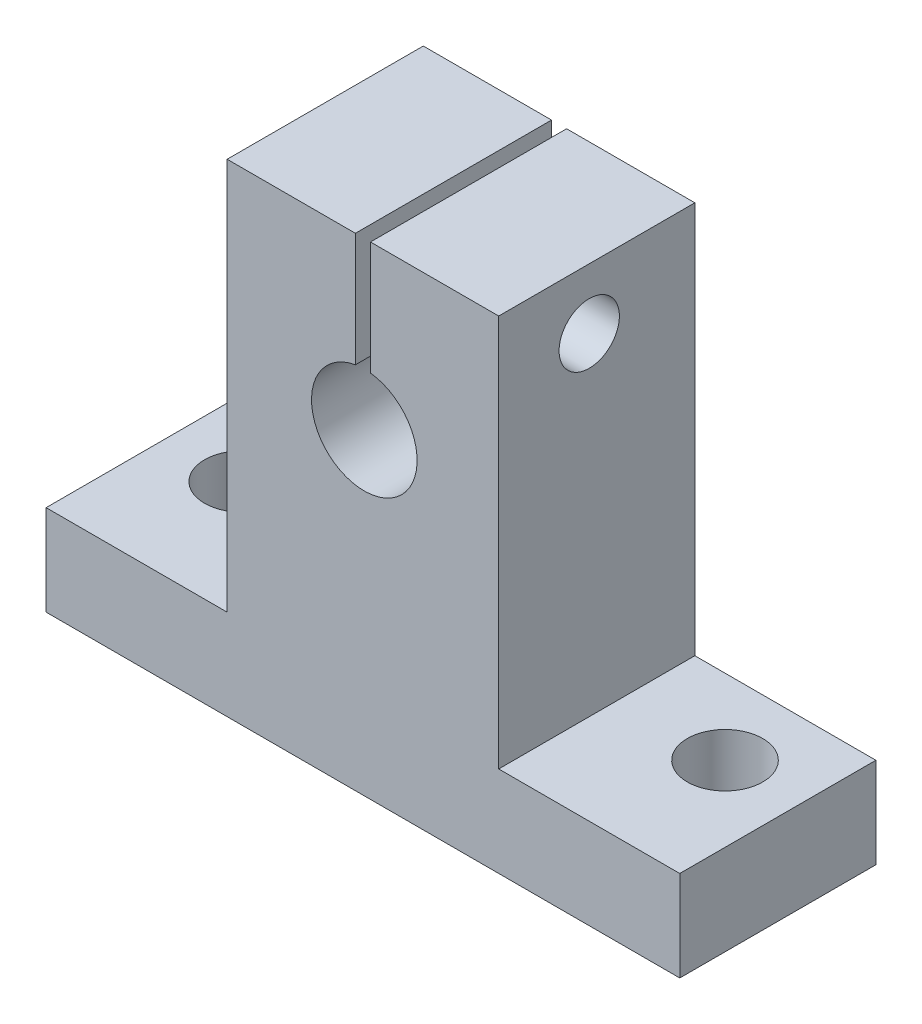
ISO-10303-21;
HEADER;
FILE_DESCRIPTION(('STEP AP214'),'2;1');
FILE_NAME('part.step','',(''),(''),'','','');
FILE_SCHEMA(('AUTOMOTIVE_DESIGN { 1 0 10303 214 1 1 1 1 }'));
ENDSEC;
DATA;
#1=APPLICATION_CONTEXT('core data for automotive mechanical design processes');
#2=APPLICATION_PROTOCOL_DEFINITION('international standard','automotive_design',2000,#1);
#3=PRODUCT_CONTEXT('',#1,'mechanical');
#4=PRODUCT('Part','Part','',(#3));
#5=PRODUCT_RELATED_PRODUCT_CATEGORY('part','',(#4));
#6=PRODUCT_DEFINITION_FORMATION('','',#4);
#7=PRODUCT_DEFINITION_CONTEXT('part definition',#1,'design');
#8=PRODUCT_DEFINITION('design','',#6,#7);
#9=PRODUCT_DEFINITION_SHAPE('','',#8);
#10=(LENGTH_UNIT() NAMED_UNIT(*) SI_UNIT(.MILLI.,.METRE.));
#11=(NAMED_UNIT(*) PLANE_ANGLE_UNIT() SI_UNIT($,.RADIAN.));
#12=(NAMED_UNIT(*) SI_UNIT($,.STERADIAN.) SOLID_ANGLE_UNIT());
#13=UNCERTAINTY_MEASURE_WITH_UNIT(LENGTH_MEASURE(1.E-05),#10,'distance_accuracy_value','');
#14=(GEOMETRIC_REPRESENTATION_CONTEXT(3) GLOBAL_UNCERTAINTY_ASSIGNED_CONTEXT((#13)) GLOBAL_UNIT_ASSIGNED_CONTEXT((#10,
#11,#12)) REPRESENTATION_CONTEXT('',''));
#15=CARTESIAN_POINT('',(0.,0.,0.));
#16=DIRECTION('',(0.,0.,1.));
#17=DIRECTION('',(1.,0.,0.));
#18=AXIS2_PLACEMENT_3D('',#15,#16,#17);
#19=CARTESIAN_POINT('',(0.,32.,0.));
#20=DIRECTION('',(0.,1.,0.));
#21=DIRECTION('',(0.,0.,1.));
#22=AXIS2_PLACEMENT_3D('',#19,#20,#21);
#23=PLANE('',#22);
#24=DIRECTION('',(-1.,0.,0.));
#25=VECTOR('',#24,1.);
#26=CARTESIAN_POINT('',(-9.,32.,-6.5));
#27=LINE('',#26,#25);
#28=CARTESIAN_POINT('',(9.,32.,-6.5));
#29=VERTEX_POINT('',#28);
#30=CARTESIAN_POINT('',(0.500000000000001,32.,-6.50000000000001));
#31=VERTEX_POINT('',#30);
#32=EDGE_CURVE('E172',#29,#31,#27,.T.);
#33=ORIENTED_EDGE('',*,*,#32,.T.);
#34=DIRECTION('',(0.,0.,1.));
#35=VECTOR('',#34,1.);
#36=CARTESIAN_POINT('',(0.500000000000001,32.,0.));
#37=LINE('',#36,#35);
#38=CARTESIAN_POINT('',(0.500000000000002,32.,6.5));
#39=VERTEX_POINT('',#38);
#40=EDGE_CURVE('E264',#31,#39,#37,.T.);
#41=ORIENTED_EDGE('',*,*,#40,.T.);
#42=DIRECTION('',(1.,0.,0.));
#43=VECTOR('',#42,1.);
#44=CARTESIAN_POINT('',(-9.,32.,6.5));
#45=LINE('',#44,#43);
#46=CARTESIAN_POINT('',(9.,32.,6.5));
#47=VERTEX_POINT('',#46);
#48=EDGE_CURVE('E151',#39,#47,#45,.T.);
#49=ORIENTED_EDGE('',*,*,#48,.T.);
#50=DIRECTION('',(0.,0.,-1.));
#51=VECTOR('',#50,1.);
#52=CARTESIAN_POINT('',(9.,32.,-6.5));
#53=LINE('',#52,#51);
#54=EDGE_CURVE('E167',#47,#29,#53,.T.);
#55=ORIENTED_EDGE('',*,*,#54,.T.);
#56=EDGE_LOOP('',(#33,#41,#49,#55));
#57=FACE_BOUND('',#56,.T.);
#58=ADVANCED_FACE('F39',(#57),#23,.T.);
#59=CARTESIAN_POINT('',(0.,6.,0.));
#60=DIRECTION('',(0.,-1.,0.));
#61=DIRECTION('',(0.,0.,-1.));
#62=AXIS2_PLACEMENT_3D('',#59,#60,#61);
#63=PLANE('',#62);
#64=CARTESIAN_POINT('',(16.,6.,-1.5));
#65=DIRECTION('',(0.,1.,0.));
#66=DIRECTION('',(0.,0.,1.));
#67=AXIS2_PLACEMENT_3D('',#64,#65,#66);
#68=CIRCLE('',#67,2.5);
#69=CARTESIAN_POINT('',(16.,6.,0.999999999999998));
#70=VERTEX_POINT('',#69);
#71=EDGE_CURVE('E205',#70,#70,#68,.T.);
#72=ORIENTED_EDGE('',*,*,#71,.F.);
#73=EDGE_LOOP('',(#72));
#74=FACE_BOUND('',#73,.T.);
#75=DIRECTION('',(0.,0.,-1.));
#76=VECTOR('',#75,1.);
#77=CARTESIAN_POINT('',(9.,6.,-6.5));
#78=LINE('',#77,#76);
#79=CARTESIAN_POINT('',(9.,6.,6.5));
#80=VERTEX_POINT('',#79);
#81=CARTESIAN_POINT('',(9.,6.,-6.5));
#82=VERTEX_POINT('',#81);
#83=EDGE_CURVE('E166',#80,#82,#78,.T.);
#84=ORIENTED_EDGE('',*,*,#83,.F.);
#85=DIRECTION('',(1.,0.,0.));
#86=VECTOR('',#85,1.);
#87=CARTESIAN_POINT('',(21.,6.,6.5));
#88=LINE('',#87,#86);
#89=CARTESIAN_POINT('',(21.,6.,6.5));
#90=VERTEX_POINT('',#89);
#91=EDGE_CURVE('E225',#80,#90,#88,.T.);
#92=ORIENTED_EDGE('',*,*,#91,.T.);
#93=DIRECTION('',(0.,0.,-1.));
#94=VECTOR('',#93,1.);
#95=CARTESIAN_POINT('',(21.,6.,-6.5));
#96=LINE('',#95,#94);
#97=CARTESIAN_POINT('',(21.,6.,-6.5));
#98=VERTEX_POINT('',#97);
#99=EDGE_CURVE('E230',#90,#98,#96,.T.);
#100=ORIENTED_EDGE('',*,*,#99,.T.);
#101=DIRECTION('',(-1.,0.,0.));
#102=VECTOR('',#101,1.);
#103=CARTESIAN_POINT('',(21.,6.,-6.5));
#104=LINE('',#103,#102);
#105=EDGE_CURVE('E234',#98,#82,#104,.T.);
#106=ORIENTED_EDGE('',*,*,#105,.T.);
#107=EDGE_LOOP('',(#84,#92,#100,#106));
#108=FACE_BOUND('',#107,.T.);
#109=ADVANCED_FACE('F299',(#74,#108),#63,.F.);
#110=CARTESIAN_POINT('',(-16.,6.,-1.5));
#111=DIRECTION('',(0.,1.,0.));
#112=DIRECTION('',(0.,0.,1.));
#113=AXIS2_PLACEMENT_3D('',#110,#111,#112);
#114=CIRCLE('',#113,2.5);
#115=CARTESIAN_POINT('',(-16.,6.,1.));
#116=VERTEX_POINT('',#115);
#117=EDGE_CURVE('E213',#116,#116,#114,.T.);
#118=ORIENTED_EDGE('',*,*,#117,.F.);
#119=EDGE_LOOP('',(#118));
#120=FACE_BOUND('',#119,.T.);
#121=DIRECTION('',(0.,0.,1.));
#122=VECTOR('',#121,1.);
#123=CARTESIAN_POINT('',(-9.,6.,-6.5));
#124=LINE('',#123,#122);
#125=CARTESIAN_POINT('',(-8.99999999999999,6.,-6.5));
#126=VERTEX_POINT('',#125);
#127=CARTESIAN_POINT('',(-9.,6.,6.5));
#128=VERTEX_POINT('',#127);
#129=EDGE_CURVE('E64',#126,#128,#124,.T.);
#130=ORIENTED_EDGE('',*,*,#129,.F.);
#131=CARTESIAN_POINT('',(-21.,6.,-6.5));
#132=VERTEX_POINT('',#131);
#133=EDGE_CURVE('E233',#126,#132,#104,.T.);
#134=ORIENTED_EDGE('',*,*,#133,.T.);
#135=DIRECTION('',(0.,0.,1.));
#136=VECTOR('',#135,1.);
#137=CARTESIAN_POINT('',(-21.,6.,-6.5));
#138=LINE('',#137,#136);
#139=CARTESIAN_POINT('',(-21.,6.,6.5));
#140=VERTEX_POINT('',#139);
#141=EDGE_CURVE('E221',#132,#140,#138,.T.);
#142=ORIENTED_EDGE('',*,*,#141,.T.);
#143=EDGE_CURVE('E227',#140,#128,#88,.T.);
#144=ORIENTED_EDGE('',*,*,#143,.T.);
#145=EDGE_LOOP('',(#130,#134,#142,#144));
#146=FACE_BOUND('',#145,.T.);
#147=ADVANCED_FACE('F282',(#120,#146),#63,.F.);
#148=CARTESIAN_POINT('',(0.,0.,0.));
#149=DIRECTION('',(0.,-1.,0.));
#150=DIRECTION('',(0.,0.,-1.));
#151=AXIS2_PLACEMENT_3D('',#148,#149,#150);
#152=PLANE('',#151);
#153=CARTESIAN_POINT('',(-16.,0.,-1.5));
#154=DIRECTION('',(0.,1.,0.));
#155=DIRECTION('',(0.,0.,1.));
#156=AXIS2_PLACEMENT_3D('',#153,#154,#155);
#157=CIRCLE('',#156,2.5);
#158=CARTESIAN_POINT('',(-16.,0.,1.));
#159=VERTEX_POINT('',#158);
#160=EDGE_CURVE('E209',#159,#159,#157,.T.);
#161=ORIENTED_EDGE('',*,*,#160,.T.);
#162=EDGE_LOOP('',(#161));
#163=FACE_BOUND('',#162,.T.);
#164=DIRECTION('',(0.,0.,1.));
#165=VECTOR('',#164,1.);
#166=CARTESIAN_POINT('',(-21.,0.,-6.5));
#167=LINE('',#166,#165);
#168=CARTESIAN_POINT('',(-21.,0.,-6.5));
#169=VERTEX_POINT('',#168);
#170=CARTESIAN_POINT('',(-21.,0.,6.5));
#171=VERTEX_POINT('',#170);
#172=EDGE_CURVE('E217',#169,#171,#167,.T.);
#173=ORIENTED_EDGE('',*,*,#172,.F.);
#174=DIRECTION('',(-1.,0.,0.));
#175=VECTOR('',#174,1.);
#176=CARTESIAN_POINT('',(21.,0.,-6.5));
#177=LINE('',#176,#175);
#178=CARTESIAN_POINT('',(21.,0.,-6.5));
#179=VERTEX_POINT('',#178);
#180=EDGE_CURVE('E226',#179,#169,#177,.T.);
#181=ORIENTED_EDGE('',*,*,#180,.F.);
#182=DIRECTION('',(0.,0.,-1.));
#183=VECTOR('',#182,1.);
#184=CARTESIAN_POINT('',(21.,0.,-6.5));
#185=LINE('',#184,#183);
#186=CARTESIAN_POINT('',(21.,0.,6.5));
#187=VERTEX_POINT('',#186);
#188=EDGE_CURVE('E244',#187,#179,#185,.T.);
#189=ORIENTED_EDGE('',*,*,#188,.F.);
#190=DIRECTION('',(1.,0.,0.));
#191=VECTOR('',#190,1.);
#192=CARTESIAN_POINT('',(21.,0.,6.5));
#193=LINE('',#192,#191);
#194=EDGE_CURVE('E241',#171,#187,#193,.T.);
#195=ORIENTED_EDGE('',*,*,#194,.F.);
#196=EDGE_LOOP('',(#173,#181,#189,#195));
#197=FACE_BOUND('',#196,.T.);
#198=CARTESIAN_POINT('',(16.,0.,-1.5));
#199=DIRECTION('',(0.,1.,0.));
#200=DIRECTION('',(0.,0.,1.));
#201=AXIS2_PLACEMENT_3D('',#198,#199,#200);
#202=CIRCLE('',#201,2.5);
#203=CARTESIAN_POINT('',(16.,0.,0.999999999999998));
#204=VERTEX_POINT('',#203);
#205=EDGE_CURVE('E204',#204,#204,#202,.T.);
#206=ORIENTED_EDGE('',*,*,#205,.T.);
#207=EDGE_LOOP('',(#206));
#208=FACE_BOUND('',#207,.T.);
#209=ADVANCED_FACE('F288',(#163,#197,#208),#152,.T.);
#210=CARTESIAN_POINT('',(-21.,6.,-6.5));
#211=DIRECTION('',(1.,0.,0.));
#212=DIRECTION('',(0.,0.,-1.));
#213=AXIS2_PLACEMENT_3D('',#210,#211,#212);
#214=PLANE('',#213);
#215=ORIENTED_EDGE('',*,*,#172,.T.);
#216=DIRECTION('',(0.,-1.,0.));
#217=VECTOR('',#216,1.);
#218=CARTESIAN_POINT('',(-21.,6.,6.5));
#219=LINE('',#218,#217);
#220=EDGE_CURVE('E260',#140,#171,#219,.T.);
#221=ORIENTED_EDGE('',*,*,#220,.F.);
#222=ORIENTED_EDGE('',*,*,#141,.F.);
#223=DIRECTION('',(0.,-1.,0.));
#224=VECTOR('',#223,1.);
#225=CARTESIAN_POINT('',(-21.,6.,-6.5));
#226=LINE('',#225,#224);
#227=EDGE_CURVE('E237',#132,#169,#226,.T.);
#228=ORIENTED_EDGE('',*,*,#227,.T.);
#229=EDGE_LOOP('',(#215,#221,#222,#228));
#230=FACE_BOUND('',#229,.T.);
#231=ADVANCED_FACE('F41',(#230),#214,.F.);
#232=CARTESIAN_POINT('',(21.,6.,6.5));
#233=DIRECTION('',(0.,0.,-1.));
#234=DIRECTION('',(-1.,0.,0.));
#235=AXIS2_PLACEMENT_3D('',#232,#233,#234);
#236=PLANE('',#235);
#237=CARTESIAN_POINT('',(0.0919504528195739,21.,6.5));
#238=DIRECTION('',(0.,0.,1.));
#239=DIRECTION('',(1.,0.,0.));
#240=AXIS2_PLACEMENT_3D('',#237,#238,#239);
#241=CIRCLE('',#240,3.5);
#242=CARTESIAN_POINT('',(-0.499999999999998,24.4495789107378,6.5));
#243=VERTEX_POINT('',#242);
#244=CARTESIAN_POINT('',(0.500000000000002,24.4761322712241,6.5));
#245=VERTEX_POINT('',#244);
#246=EDGE_CURVE('E139',#243,#245,#241,.T.);
#247=ORIENTED_EDGE('',*,*,#246,.F.);
#248=DIRECTION('',(0.,-1.,0.));
#249=VECTOR('',#248,1.);
#250=CARTESIAN_POINT('',(-0.499999999999995,0.,6.5));
#251=LINE('',#250,#249);
#252=CARTESIAN_POINT('',(-0.499999999999999,32.,6.5));
#253=VERTEX_POINT('',#252);
#254=EDGE_CURVE('E136',#253,#243,#251,.T.);
#255=ORIENTED_EDGE('',*,*,#254,.F.);
#256=CARTESIAN_POINT('',(-9.,32.,6.5));
#257=VERTEX_POINT('',#256);
#258=EDGE_CURVE('E179',#257,#253,#45,.T.);
#259=ORIENTED_EDGE('',*,*,#258,.F.);
#260=DIRECTION('',(0.,-1.,0.));
#261=VECTOR('',#260,1.);
#262=CARTESIAN_POINT('',(-9.,32.,6.5));
#263=LINE('',#262,#261);
#264=EDGE_CURVE('E192',#257,#128,#263,.T.);
#265=ORIENTED_EDGE('',*,*,#264,.T.);
#266=ORIENTED_EDGE('',*,*,#143,.F.);
#267=ORIENTED_EDGE('',*,*,#220,.T.);
#268=ORIENTED_EDGE('',*,*,#194,.T.);
#269=DIRECTION('',(0.,-1.,0.));
#270=VECTOR('',#269,1.);
#271=CARTESIAN_POINT('',(21.,6.,6.5));
#272=LINE('',#271,#270);
#273=EDGE_CURVE('E256',#90,#187,#272,.T.);
#274=ORIENTED_EDGE('',*,*,#273,.F.);
#275=ORIENTED_EDGE('',*,*,#91,.F.);
#276=DIRECTION('',(0.,-1.,0.));
#277=VECTOR('',#276,1.);
#278=CARTESIAN_POINT('',(9.,32.,6.5));
#279=LINE('',#278,#277);
#280=EDGE_CURVE('E183',#47,#80,#279,.T.);
#281=ORIENTED_EDGE('',*,*,#280,.F.);
#282=ORIENTED_EDGE('',*,*,#48,.F.);
#283=DIRECTION('',(0.,-1.,0.));
#284=VECTOR('',#283,1.);
#285=CARTESIAN_POINT('',(0.500000000000004,0.,6.5));
#286=LINE('',#285,#284);
#287=EDGE_CURVE('E56',#39,#245,#286,.T.);
#288=ORIENTED_EDGE('',*,*,#287,.T.);
#289=EDGE_LOOP('',(#247,#255,#259,#265,#266,#267,#268,#274,#275,#281,#282,#288));
#290=FACE_BOUND('',#289,.T.);
#291=ADVANCED_FACE('F149',(#290),#236,.F.);
#292=CARTESIAN_POINT('',(21.,6.,-6.5));
#293=DIRECTION('',(-1.,0.,0.));
#294=DIRECTION('',(0.,0.,1.));
#295=AXIS2_PLACEMENT_3D('',#292,#293,#294);
#296=PLANE('',#295);
#297=ORIENTED_EDGE('',*,*,#188,.T.);
#298=DIRECTION('',(0.,-1.,0.));
#299=VECTOR('',#298,1.);
#300=CARTESIAN_POINT('',(21.,6.,-6.5));
#301=LINE('',#300,#299);
#302=EDGE_CURVE('E252',#98,#179,#301,.T.);
#303=ORIENTED_EDGE('',*,*,#302,.F.);
#304=ORIENTED_EDGE('',*,*,#99,.F.);
#305=ORIENTED_EDGE('',*,*,#273,.T.);
#306=EDGE_LOOP('',(#297,#303,#304,#305));
#307=FACE_BOUND('',#306,.T.);
#308=ADVANCED_FACE('F295',(#307),#296,.F.);
#309=CARTESIAN_POINT('',(21.,6.,-6.5));
#310=DIRECTION('',(0.,0.,1.));
#311=DIRECTION('',(1.,0.,0.));
#312=AXIS2_PLACEMENT_3D('',#309,#310,#311);
#313=PLANE('',#312);
#314=CARTESIAN_POINT('',(-0.499999999999999,32.,-6.50000000000001));
#315=VERTEX_POINT('',#314);
#316=CARTESIAN_POINT('',(-9.,32.,-6.5));
#317=VERTEX_POINT('',#316);
#318=EDGE_CURVE('E171',#315,#317,#27,.T.);
#319=ORIENTED_EDGE('',*,*,#318,.F.);
#320=DIRECTION('',(0.,-1.,0.));
#321=VECTOR('',#320,1.);
#322=CARTESIAN_POINT('',(-0.499999999999994,6.,-6.5));
#323=LINE('',#322,#321);
#324=CARTESIAN_POINT('',(-0.499999999999998,24.4495789107378,-6.5));
#325=VERTEX_POINT('',#324);
#326=EDGE_CURVE('E162',#315,#325,#323,.T.);
#327=ORIENTED_EDGE('',*,*,#326,.T.);
#328=CARTESIAN_POINT('',(0.0919504528195739,21.,-6.5));
#329=DIRECTION('',(0.,0.,1.));
#330=DIRECTION('',(1.,0.,0.));
#331=AXIS2_PLACEMENT_3D('',#328,#329,#330);
#332=CIRCLE('',#331,3.5);
#333=CARTESIAN_POINT('',(0.500000000000002,24.4761322712241,-6.5));
#334=VERTEX_POINT('',#333);
#335=EDGE_CURVE('E11',#325,#334,#332,.T.);
#336=ORIENTED_EDGE('',*,*,#335,.T.);
#337=DIRECTION('',(0.,-1.,0.));
#338=VECTOR('',#337,1.);
#339=CARTESIAN_POINT('',(0.500000000000004,6.,-6.5));
#340=LINE('',#339,#338);
#341=EDGE_CURVE('E132',#31,#334,#340,.T.);
#342=ORIENTED_EDGE('',*,*,#341,.F.);
#343=ORIENTED_EDGE('',*,*,#32,.F.);
#344=DIRECTION('',(0.,-1.,0.));
#345=VECTOR('',#344,1.);
#346=CARTESIAN_POINT('',(9.,32.,-6.5));
#347=LINE('',#346,#345);
#348=EDGE_CURVE('E200',#29,#82,#347,.T.);
#349=ORIENTED_EDGE('',*,*,#348,.T.);
#350=ORIENTED_EDGE('',*,*,#105,.F.);
#351=ORIENTED_EDGE('',*,*,#302,.T.);
#352=ORIENTED_EDGE('',*,*,#180,.T.);
#353=ORIENTED_EDGE('',*,*,#227,.F.);
#354=ORIENTED_EDGE('',*,*,#133,.F.);
#355=DIRECTION('',(0.,-1.,0.));
#356=VECTOR('',#355,1.);
#357=CARTESIAN_POINT('',(-9.,32.,-6.5));
#358=LINE('',#357,#356);
#359=EDGE_CURVE('E196',#317,#126,#358,.T.);
#360=ORIENTED_EDGE('',*,*,#359,.F.);
#361=EDGE_LOOP('',(#319,#327,#336,#342,#343,#349,#350,#351,#352,#353,#354,#360));
#362=FACE_BOUND('',#361,.T.);
#363=ADVANCED_FACE('F309',(#362),#313,.F.);
#364=CARTESIAN_POINT('',(-16.,6.,-1.5));
#365=DIRECTION('',(0.,-1.,0.));
#366=DIRECTION('',(0.,0.,-1.));
#367=AXIS2_PLACEMENT_3D('',#364,#365,#366);
#368=CYLINDRICAL_SURFACE('',#367,2.5);
#369=ORIENTED_EDGE('',*,*,#117,.T.);
#370=EDGE_LOOP('',(#369));
#371=FACE_BOUND('',#370,.T.);
#372=ORIENTED_EDGE('',*,*,#160,.F.);
#373=EDGE_LOOP('',(#372));
#374=FACE_BOUND('',#373,.T.);
#375=ADVANCED_FACE('F312',(#371,#374),#368,.F.);
#376=CARTESIAN_POINT('',(16.,6.,-1.5));
#377=DIRECTION('',(0.,-1.,0.));
#378=DIRECTION('',(0.,0.,-1.));
#379=AXIS2_PLACEMENT_3D('',#376,#377,#378);
#380=CYLINDRICAL_SURFACE('',#379,2.5);
#381=ORIENTED_EDGE('',*,*,#71,.T.);
#382=EDGE_LOOP('',(#381));
#383=FACE_BOUND('',#382,.T.);
#384=ORIENTED_EDGE('',*,*,#205,.F.);
#385=EDGE_LOOP('',(#384));
#386=FACE_BOUND('',#385,.T.);
#387=ADVANCED_FACE('F318',(#383,#386),#380,.F.);
#388=CARTESIAN_POINT('',(9.,32.,-6.5));
#389=DIRECTION('',(-1.,0.,0.));
#390=DIRECTION('',(0.,0.,1.));
#391=AXIS2_PLACEMENT_3D('',#388,#389,#390);
#392=PLANE('',#391);
#393=CARTESIAN_POINT('',(9.,28.,0.499999999999997));
#394=DIRECTION('',(1.,0.,0.));
#395=DIRECTION('',(0.,0.,-1.));
#396=AXIS2_PLACEMENT_3D('',#393,#394,#395);
#397=CIRCLE('',#396,2.);
#398=CARTESIAN_POINT('',(9.,28.,-1.5));
#399=VERTEX_POINT('',#398);
#400=EDGE_CURVE('E476',#399,#399,#397,.T.);
#401=ORIENTED_EDGE('',*,*,#400,.F.);
#402=EDGE_LOOP('',(#401));
#403=FACE_BOUND('',#402,.T.);
#404=ORIENTED_EDGE('',*,*,#83,.T.);
#405=ORIENTED_EDGE('',*,*,#348,.F.);
#406=ORIENTED_EDGE('',*,*,#54,.F.);
#407=ORIENTED_EDGE('',*,*,#280,.T.);
#408=EDGE_LOOP('',(#404,#405,#406,#407));
#409=FACE_BOUND('',#408,.T.);
#410=ADVANCED_FACE('F307',(#403,#409),#392,.F.);
#411=CARTESIAN_POINT('',(-9.,32.,-6.5));
#412=DIRECTION('',(1.,0.,0.));
#413=DIRECTION('',(0.,0.,-1.));
#414=AXIS2_PLACEMENT_3D('',#411,#412,#413);
#415=PLANE('',#414);
#416=CARTESIAN_POINT('',(-9.,28.,0.499999999999997));
#417=DIRECTION('',(1.,0.,0.));
#418=DIRECTION('',(0.,0.,-1.));
#419=AXIS2_PLACEMENT_3D('',#416,#417,#418);
#420=CIRCLE('',#419,2.);
#421=CARTESIAN_POINT('',(-9.,28.,-1.5));
#422=VERTEX_POINT('',#421);
#423=EDGE_CURVE('E146',#422,#422,#420,.T.);
#424=ORIENTED_EDGE('',*,*,#423,.T.);
#425=EDGE_LOOP('',(#424));
#426=FACE_BOUND('',#425,.T.);
#427=ORIENTED_EDGE('',*,*,#129,.T.);
#428=ORIENTED_EDGE('',*,*,#264,.F.);
#429=DIRECTION('',(0.,0.,1.));
#430=VECTOR('',#429,1.);
#431=CARTESIAN_POINT('',(-9.,32.,-6.5));
#432=LINE('',#431,#430);
#433=EDGE_CURVE('E176',#317,#257,#432,.T.);
#434=ORIENTED_EDGE('',*,*,#433,.F.);
#435=ORIENTED_EDGE('',*,*,#359,.T.);
#436=EDGE_LOOP('',(#427,#428,#434,#435));
#437=FACE_BOUND('',#436,.T.);
#438=ADVANCED_FACE('F279',(#426,#437),#415,.F.);
#439=DIRECTION('',(0.,0.,1.));
#440=VECTOR('',#439,1.);
#441=CARTESIAN_POINT('',(-0.499999999999999,32.,0.));
#442=LINE('',#441,#440);
#443=EDGE_CURVE('E49',#315,#253,#442,.T.);
#444=ORIENTED_EDGE('',*,*,#443,.F.);
#445=ORIENTED_EDGE('',*,*,#318,.T.);
#446=ORIENTED_EDGE('',*,*,#433,.T.);
#447=ORIENTED_EDGE('',*,*,#258,.T.);
#448=EDGE_LOOP('',(#444,#445,#446,#447));
#449=FACE_BOUND('',#448,.T.);
#450=ADVANCED_FACE('F274',(#449),#23,.T.);
#451=CARTESIAN_POINT('',(0.0919504528195739,21.,-19.5));
#452=DIRECTION('',(0.,0.,1.));
#453=DIRECTION('',(1.,0.,0.));
#454=AXIS2_PLACEMENT_3D('',#451,#452,#453);
#455=CYLINDRICAL_SURFACE('',#454,3.5);
#456=DIRECTION('',(0.,0.,1.));
#457=VECTOR('',#456,1.);
#458=CARTESIAN_POINT('',(-0.499999999999998,24.4495789107378,-19.5));
#459=LINE('',#458,#457);
#460=EDGE_CURVE('E135',#325,#243,#459,.T.);
#461=ORIENTED_EDGE('',*,*,#460,.T.);
#462=ORIENTED_EDGE('',*,*,#246,.T.);
#463=DIRECTION('',(0.,0.,1.));
#464=VECTOR('',#463,1.);
#465=CARTESIAN_POINT('',(0.500000000000002,24.4761322712241,-19.5));
#466=LINE('',#465,#464);
#467=EDGE_CURVE('E128',#334,#245,#466,.T.);
#468=ORIENTED_EDGE('',*,*,#467,.F.);
#469=ORIENTED_EDGE('',*,*,#335,.F.);
#470=EDGE_LOOP('',(#461,#462,#468,#469));
#471=FACE_BOUND('',#470,.T.);
#472=ADVANCED_FACE('F140',(#471),#455,.F.);
#473=CARTESIAN_POINT('',(-0.499999999999995,0.,-19.5));
#474=DIRECTION('',(-1.,0.,0.));
#475=DIRECTION('',(0.,-1.,0.));
#476=AXIS2_PLACEMENT_3D('',#473,#474,#475);
#477=PLANE('',#476);
#478=CARTESIAN_POINT('',(-0.5,28.,0.499999999999997));
#479=DIRECTION('',(-1.,0.,0.));
#480=DIRECTION('',(0.,-1.,0.));
#481=AXIS2_PLACEMENT_3D('',#478,#479,#480);
#482=CIRCLE('',#481,2.);
#483=CARTESIAN_POINT('',(-0.499999999999997,28.,-1.5));
#484=VERTEX_POINT('',#483);
#485=EDGE_CURVE('E470',#484,#484,#482,.T.);
#486=ORIENTED_EDGE('',*,*,#485,.T.);
#487=EDGE_LOOP('',(#486));
#488=FACE_BOUND('',#487,.T.);
#489=ORIENTED_EDGE('',*,*,#443,.T.);
#490=ORIENTED_EDGE('',*,*,#254,.T.);
#491=ORIENTED_EDGE('',*,*,#460,.F.);
#492=ORIENTED_EDGE('',*,*,#326,.F.);
#493=EDGE_LOOP('',(#489,#490,#491,#492));
#494=FACE_BOUND('',#493,.T.);
#495=ADVANCED_FACE('F270',(#488,#494),#477,.F.);
#496=CARTESIAN_POINT('',(0.500000000000004,0.,-19.5));
#497=DIRECTION('',(-1.,0.,0.));
#498=DIRECTION('',(0.,-1.,0.));
#499=AXIS2_PLACEMENT_3D('',#496,#497,#498);
#500=PLANE('',#499);
#501=CARTESIAN_POINT('',(0.499999999999997,28.,0.499999999999997));
#502=DIRECTION('',(-1.,0.,0.));
#503=DIRECTION('',(0.,-1.,0.));
#504=AXIS2_PLACEMENT_3D('',#501,#502,#503);
#505=CIRCLE('',#504,2.);
#506=CARTESIAN_POINT('',(0.499999999999997,28.,-1.5));
#507=VERTEX_POINT('',#506);
#508=EDGE_CURVE('E43',#507,#507,#505,.T.);
#509=ORIENTED_EDGE('',*,*,#508,.F.);
#510=EDGE_LOOP('',(#509));
#511=FACE_BOUND('',#510,.T.);
#512=ORIENTED_EDGE('',*,*,#341,.T.);
#513=ORIENTED_EDGE('',*,*,#467,.T.);
#514=ORIENTED_EDGE('',*,*,#287,.F.);
#515=ORIENTED_EDGE('',*,*,#40,.F.);
#516=EDGE_LOOP('',(#512,#513,#514,#515));
#517=FACE_BOUND('',#516,.T.);
#518=ADVANCED_FACE('F130',(#511,#517),#500,.T.);
#519=CARTESIAN_POINT('',(-17.,28.,0.499999999999997));
#520=DIRECTION('',(1.,0.,0.));
#521=DIRECTION('',(0.,0.,-1.));
#522=AXIS2_PLACEMENT_3D('',#519,#520,#521);
#523=CYLINDRICAL_SURFACE('',#522,2.);
#524=CARTESIAN_POINT('',(0.499999999999997,28.,-1.5));
#525=CARTESIAN_POINT('',(0.588541666666663,28.,-1.5));
#526=CARTESIAN_POINT('',(0.677083333333329,28.,-1.5));
#527=CARTESIAN_POINT('',(0.854166666666663,28.,-1.5));
#528=CARTESIAN_POINT('',(0.94270833333333,28.,-1.5));
#529=CARTESIAN_POINT('',(1.11979166666666,28.,-1.5));
#530=CARTESIAN_POINT('',(1.20833333333333,28.,-1.5));
#531=CARTESIAN_POINT('',(1.38541666666666,28.,-1.5));
#532=CARTESIAN_POINT('',(1.47395833333333,28.,-1.5));
#533=CARTESIAN_POINT('',(1.65104166666666,28.,-1.5));
#534=CARTESIAN_POINT('',(1.73958333333333,28.,-1.5));
#535=CARTESIAN_POINT('',(1.91666666666666,28.,-1.5));
#536=CARTESIAN_POINT('',(2.00520833333333,28.,-1.5));
#537=CARTESIAN_POINT('',(2.18229166666666,28.,-1.5));
#538=CARTESIAN_POINT('',(2.27083333333333,28.,-1.5));
#539=CARTESIAN_POINT('',(2.44791666666666,28.,-1.5));
#540=CARTESIAN_POINT('',(2.53645833333333,28.,-1.5));
#541=CARTESIAN_POINT('',(2.71354166666666,28.,-1.5));
#542=CARTESIAN_POINT('',(2.80208333333333,28.,-1.5));
#543=CARTESIAN_POINT('',(2.97916666666666,28.,-1.5));
#544=CARTESIAN_POINT('',(3.06770833333333,28.,-1.5));
#545=CARTESIAN_POINT('',(3.24479166666666,28.,-1.5));
#546=CARTESIAN_POINT('',(3.33333333333333,28.,-1.5));
#547=CARTESIAN_POINT('',(3.51041666666666,28.,-1.5));
#548=CARTESIAN_POINT('',(3.59895833333333,28.,-1.5));
#549=CARTESIAN_POINT('',(3.77604166666666,28.,-1.5));
#550=CARTESIAN_POINT('',(3.86458333333333,28.,-1.5));
#551=CARTESIAN_POINT('',(4.04166666666667,28.,-1.5));
#552=CARTESIAN_POINT('',(4.13020833333333,28.,-1.5));
#553=CARTESIAN_POINT('',(4.30729166666666,28.,-1.5));
#554=CARTESIAN_POINT('',(4.39583333333333,28.,-1.5));
#555=CARTESIAN_POINT('',(4.57291666666666,28.,-1.5));
#556=CARTESIAN_POINT('',(4.66145833333333,28.,-1.5));
#557=CARTESIAN_POINT('',(4.83854166666666,28.,-1.5));
#558=CARTESIAN_POINT('',(4.92708333333333,28.,-1.5));
#559=CARTESIAN_POINT('',(5.10416666666667,28.,-1.5));
#560=CARTESIAN_POINT('',(5.19270833333333,28.,-1.5));
#561=CARTESIAN_POINT('',(5.36979166666666,28.,-1.5));
#562=CARTESIAN_POINT('',(5.45833333333333,28.,-1.5));
#563=CARTESIAN_POINT('',(5.63541666666666,28.,-1.5));
#564=CARTESIAN_POINT('',(5.72395833333333,28.,-1.5));
#565=CARTESIAN_POINT('',(5.90104166666666,28.,-1.5));
#566=CARTESIAN_POINT('',(5.98958333333333,28.,-1.5));
#567=CARTESIAN_POINT('',(6.16666666666666,28.,-1.5));
#568=CARTESIAN_POINT('',(6.25520833333333,28.,-1.5));
#569=CARTESIAN_POINT('',(6.43229166666667,28.,-1.5));
#570=CARTESIAN_POINT('',(6.52083333333333,28.,-1.5));
#571=CARTESIAN_POINT('',(6.69791666666666,28.,-1.5));
#572=CARTESIAN_POINT('',(6.78645833333333,28.,-1.5));
#573=CARTESIAN_POINT('',(6.96354166666666,28.,-1.5));
#574=CARTESIAN_POINT('',(7.05208333333333,28.,-1.5));
#575=CARTESIAN_POINT('',(7.22916666666667,28.,-1.5));
#576=CARTESIAN_POINT('',(7.31770833333333,28.,-1.5));
#577=CARTESIAN_POINT('',(7.49479166666667,28.,-1.5));
#578=CARTESIAN_POINT('',(7.58333333333333,28.,-1.5));
#579=CARTESIAN_POINT('',(7.76041666666666,28.,-1.5));
#580=CARTESIAN_POINT('',(7.84895833333333,28.,-1.5));
#581=CARTESIAN_POINT('',(8.02604166666666,28.,-1.5));
#582=CARTESIAN_POINT('',(8.11458333333333,28.,-1.5));
#583=CARTESIAN_POINT('',(8.29166666666666,28.,-1.5));
#584=CARTESIAN_POINT('',(8.38020833333333,28.,-1.5));
#585=CARTESIAN_POINT('',(8.55729166666666,28.,-1.5));
#586=CARTESIAN_POINT('',(8.64583333333333,28.,-1.5));
#587=CARTESIAN_POINT('',(8.82291666666666,28.,-1.5));
#588=CARTESIAN_POINT('',(8.91145833333333,28.,-1.5));
#589=CARTESIAN_POINT('',(9.,28.,-1.5));
#590=B_SPLINE_CURVE_WITH_KNOTS('',3,(#524,#525,#526,#527,#528,#529,#530,#531,#532,#533,#534,
#535,#536,#537,#538,#539,#540,#541,#542,#543,#544,#545,#546,#547,#548,#549,#550,#551,#552,#553,
#554,#555,#556,#557,#558,#559,#560,#561,#562,#563,#564,#565,#566,#567,#568,#569,#570,#571,#572,
#573,#574,#575,#576,#577,#578,#579,#580,#581,#582,#583,#584,#585,#586,#587,#588,#589),
.UNSPECIFIED.,.F.,.F.,(4,2,2,2,2,2,2,2,2,2,2,2,2,2,2,2,2,2,2,2,2,2,2,2,2,2,2,2,2,2,2,2,4),(0.,
0.265624999999999,0.53125,0.796874999999999,1.0625,1.328125,1.59375,1.859375,2.125,2.390625,
2.65625,2.921875,3.1875,3.453125,3.71875,3.984375,4.25,4.515625,4.78125,5.046875,5.3125,
5.578125,5.84375,6.109375,6.375,6.640625,6.90625,7.171875,7.4375,7.703125,7.96875,8.234375,8.5),.UNSPECIFIED.);
#591=EDGE_CURVE('BSEAM444',#507,#399,#590,.T.);
#592=ORIENTED_EDGE('',*,*,#508,.T.);
#593=ORIENTED_EDGE('',*,*,#400,.T.);
#594=ORIENTED_EDGE('',*,*,#591,.T.);
#595=ORIENTED_EDGE('',*,*,#591,.F.);
#596=EDGE_LOOP('',(#592,#594,#593,#595));
#597=FACE_BOUND('',#596,.T.);
#598=ADVANCED_FACE('F444',(#597),#523,.F.);
#599=CARTESIAN_POINT('',(-0.499999999999997,28.,-1.5));
#600=CARTESIAN_POINT('',(-0.588541666666663,28.,-1.5));
#601=CARTESIAN_POINT('',(-0.677083333333329,28.,-1.5));
#602=CARTESIAN_POINT('',(-0.854166666666663,28.,-1.5));
#603=CARTESIAN_POINT('',(-0.94270833333333,28.,-1.5));
#604=CARTESIAN_POINT('',(-1.11979166666666,28.,-1.5));
#605=CARTESIAN_POINT('',(-1.20833333333333,28.,-1.5));
#606=CARTESIAN_POINT('',(-1.38541666666666,28.,-1.5));
#607=CARTESIAN_POINT('',(-1.47395833333333,28.,-1.5));
#608=CARTESIAN_POINT('',(-1.65104166666666,28.,-1.5));
#609=CARTESIAN_POINT('',(-1.73958333333333,28.,-1.5));
#610=CARTESIAN_POINT('',(-1.91666666666666,28.,-1.5));
#611=CARTESIAN_POINT('',(-2.00520833333333,28.,-1.5));
#612=CARTESIAN_POINT('',(-2.18229166666666,28.,-1.5));
#613=CARTESIAN_POINT('',(-2.27083333333333,28.,-1.5));
#614=CARTESIAN_POINT('',(-2.44791666666666,28.,-1.5));
#615=CARTESIAN_POINT('',(-2.53645833333333,28.,-1.5));
#616=CARTESIAN_POINT('',(-2.71354166666666,28.,-1.5));
#617=CARTESIAN_POINT('',(-2.80208333333333,28.,-1.5));
#618=CARTESIAN_POINT('',(-2.97916666666666,28.,-1.5));
#619=CARTESIAN_POINT('',(-3.06770833333333,28.,-1.5));
#620=CARTESIAN_POINT('',(-3.24479166666666,28.,-1.5));
#621=CARTESIAN_POINT('',(-3.33333333333333,28.,-1.5));
#622=CARTESIAN_POINT('',(-3.51041666666666,28.,-1.5));
#623=CARTESIAN_POINT('',(-3.59895833333333,28.,-1.5));
#624=CARTESIAN_POINT('',(-3.77604166666666,28.,-1.5));
#625=CARTESIAN_POINT('',(-3.86458333333333,28.,-1.5));
#626=CARTESIAN_POINT('',(-4.04166666666667,28.,-1.5));
#627=CARTESIAN_POINT('',(-4.13020833333333,28.,-1.5));
#628=CARTESIAN_POINT('',(-4.30729166666667,28.,-1.5));
#629=CARTESIAN_POINT('',(-4.39583333333333,28.,-1.5));
#630=CARTESIAN_POINT('',(-4.57291666666667,28.,-1.5));
#631=CARTESIAN_POINT('',(-4.66145833333333,28.,-1.5));
#632=CARTESIAN_POINT('',(-4.83854166666667,28.,-1.5));
#633=CARTESIAN_POINT('',(-4.92708333333333,28.,-1.5));
#634=CARTESIAN_POINT('',(-5.10416666666667,28.,-1.5));
#635=CARTESIAN_POINT('',(-5.19270833333333,28.,-1.5));
#636=CARTESIAN_POINT('',(-5.36979166666667,28.,-1.5));
#637=CARTESIAN_POINT('',(-5.45833333333333,28.,-1.5));
#638=CARTESIAN_POINT('',(-5.63541666666667,28.,-1.5));
#639=CARTESIAN_POINT('',(-5.72395833333333,28.,-1.5));
#640=CARTESIAN_POINT('',(-5.90104166666667,28.,-1.5));
#641=CARTESIAN_POINT('',(-5.98958333333333,28.,-1.5));
#642=CARTESIAN_POINT('',(-6.16666666666667,28.,-1.5));
#643=CARTESIAN_POINT('',(-6.25520833333333,28.,-1.5));
#644=CARTESIAN_POINT('',(-6.43229166666667,28.,-1.5));
#645=CARTESIAN_POINT('',(-6.52083333333333,28.,-1.5));
#646=CARTESIAN_POINT('',(-6.69791666666667,28.,-1.5));
#647=CARTESIAN_POINT('',(-6.78645833333333,28.,-1.5));
#648=CARTESIAN_POINT('',(-6.96354166666667,28.,-1.5));
#649=CARTESIAN_POINT('',(-7.05208333333333,28.,-1.5));
#650=CARTESIAN_POINT('',(-7.22916666666667,28.,-1.5));
#651=CARTESIAN_POINT('',(-7.31770833333333,28.,-1.5));
#652=CARTESIAN_POINT('',(-7.49479166666667,28.,-1.5));
#653=CARTESIAN_POINT('',(-7.58333333333333,28.,-1.5));
#654=CARTESIAN_POINT('',(-7.76041666666667,28.,-1.5));
#655=CARTESIAN_POINT('',(-7.84895833333333,28.,-1.5));
#656=CARTESIAN_POINT('',(-8.02604166666667,28.,-1.5));
#657=CARTESIAN_POINT('',(-8.11458333333333,28.,-1.5));
#658=CARTESIAN_POINT('',(-8.29166666666667,28.,-1.5));
#659=CARTESIAN_POINT('',(-8.38020833333334,28.,-1.5));
#660=CARTESIAN_POINT('',(-8.55729166666667,28.,-1.5));
#661=CARTESIAN_POINT('',(-8.64583333333334,28.,-1.5));
#662=CARTESIAN_POINT('',(-8.82291666666667,28.,-1.5));
#663=CARTESIAN_POINT('',(-8.91145833333334,28.,-1.5));
#664=CARTESIAN_POINT('',(-9.,28.,-1.5));
#665=B_SPLINE_CURVE_WITH_KNOTS('',3,(#599,#600,#601,#602,#603,#604,#605,#606,#607,#608,#609,
#610,#611,#612,#613,#614,#615,#616,#617,#618,#619,#620,#621,#622,#623,#624,#625,#626,#627,#628,
#629,#630,#631,#632,#633,#634,#635,#636,#637,#638,#639,#640,#641,#642,#643,#644,#645,#646,#647,
#648,#649,#650,#651,#652,#653,#654,#655,#656,#657,#658,#659,#660,#661,#662,#663,#664),
.UNSPECIFIED.,.F.,.F.,(4,2,2,2,2,2,2,2,2,2,2,2,2,2,2,2,2,2,2,2,2,2,2,2,2,2,2,2,2,2,2,2,4),(0.,
0.265624999999999,0.53125,0.796875000000002,1.0625,1.328125,1.59375,1.859375,2.125,2.390625,
2.65625,2.921875,3.1875,3.453125,3.71875,3.984375,4.25,4.515625,4.78125,5.046875,5.3125,
5.578125,5.84375,6.109375,6.375,6.640625,6.90625,7.171875,7.4375,7.70312500000001,
7.96875000000001,8.23437500000001,8.50000000000001),.UNSPECIFIED.);
#666=EDGE_CURVE('BSEAM454',#484,#422,#665,.T.);
#667=ORIENTED_EDGE('',*,*,#485,.F.);
#668=ORIENTED_EDGE('',*,*,#423,.F.);
#669=ORIENTED_EDGE('',*,*,#666,.T.);
#670=ORIENTED_EDGE('',*,*,#666,.F.);
#671=EDGE_LOOP('',(#667,#669,#668,#670));
#672=FACE_BOUND('',#671,.T.);
#673=ADVANCED_FACE('F454',(#672),#523,.F.);
#674=CLOSED_SHELL('',(#58,#109,#147,#209,#231,#291,#308,#363,#375,#387,#410,#438,#450,#472,#495,
#518,#598,#673));
#675=MANIFOLD_SOLID_BREP('B2',#674);
#676=ADVANCED_BREP_SHAPE_REPRESENTATION('',(#18,#675),#14);
#677=SHAPE_DEFINITION_REPRESENTATION(#9,#676);
ENDSEC;
END-ISO-10303-21;
